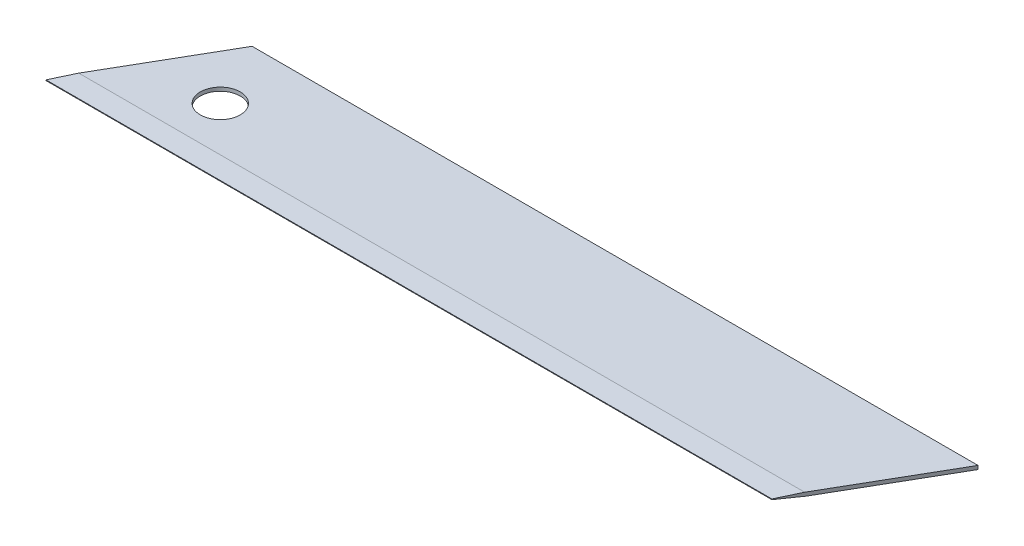
ISO-10303-21;
HEADER;
FILE_DESCRIPTION(('STEP AP214'),'2;1');
FILE_NAME('part.step','',(''),(''),'','','');
FILE_SCHEMA(('AUTOMOTIVE_DESIGN { 1 0 10303 214 1 1 1 1 }'));
ENDSEC;
DATA;
#1=APPLICATION_CONTEXT('core data for automotive mechanical design processes');
#2=APPLICATION_PROTOCOL_DEFINITION('international standard','automotive_design',2000,#1);
#3=PRODUCT_CONTEXT('',#1,'mechanical');
#4=PRODUCT('Part','Part','',(#3));
#5=PRODUCT_RELATED_PRODUCT_CATEGORY('part','',(#4));
#6=PRODUCT_DEFINITION_FORMATION('','',#4);
#7=PRODUCT_DEFINITION_CONTEXT('part definition',#1,'design');
#8=PRODUCT_DEFINITION('design','',#6,#7);
#9=PRODUCT_DEFINITION_SHAPE('','',#8);
#10=(LENGTH_UNIT() NAMED_UNIT(*) SI_UNIT(.MILLI.,.METRE.));
#11=(NAMED_UNIT(*) PLANE_ANGLE_UNIT() SI_UNIT($,.RADIAN.));
#12=(NAMED_UNIT(*) SI_UNIT($,.STERADIAN.) SOLID_ANGLE_UNIT());
#13=UNCERTAINTY_MEASURE_WITH_UNIT(LENGTH_MEASURE(1.E-05),#10,'distance_accuracy_value','');
#14=(GEOMETRIC_REPRESENTATION_CONTEXT(3) GLOBAL_UNCERTAINTY_ASSIGNED_CONTEXT((#13)) GLOBAL_UNIT_ASSIGNED_CONTEXT((#10,
#11,#12)) REPRESENTATION_CONTEXT('',''));
#15=CARTESIAN_POINT('',(0.,0.,0.));
#16=DIRECTION('',(0.,0.,1.));
#17=DIRECTION('',(1.,0.,0.));
#18=AXIS2_PLACEMENT_3D('',#15,#16,#17);
#19=CARTESIAN_POINT('',(0.,0.5,0.));
#20=DIRECTION('',(0.,0.,-1.));
#21=DIRECTION('',(-1.,0.,0.));
#22=AXIS2_PLACEMENT_3D('',#19,#20,#21);
#23=PLANE('',#22);
#24=DIRECTION('',(0.,-1.,0.));
#25=VECTOR('',#24,1.);
#26=CARTESIAN_POINT('',(100.,0.5,0.));
#27=LINE('',#26,#25);
#28=CARTESIAN_POINT('',(100.,0.299999999999999,0.));
#29=VERTEX_POINT('',#28);
#30=CARTESIAN_POINT('',(100.,0.209780435830533,0.));
#31=VERTEX_POINT('',#30);
#32=EDGE_CURVE('E106',#29,#31,#27,.T.);
#33=ORIENTED_EDGE('',*,*,#32,.F.);
#34=DIRECTION('',(-1.,0.,0.));
#35=VECTOR('',#34,1.);
#36=CARTESIAN_POINT('',(0.,0.299999999999999,0.));
#37=LINE('',#36,#35);
#38=CARTESIAN_POINT('',(0.,0.299999999999999,0.));
#39=VERTEX_POINT('',#38);
#40=EDGE_CURVE('E46',#29,#39,#37,.T.);
#41=ORIENTED_EDGE('',*,*,#40,.T.);
#42=DIRECTION('',(0.,-1.,0.));
#43=VECTOR('',#42,1.);
#44=CARTESIAN_POINT('',(0.,0.5,0.));
#45=LINE('',#44,#43);
#46=CARTESIAN_POINT('',(0.,0.209780435830533,0.));
#47=VERTEX_POINT('',#46);
#48=EDGE_CURVE('E114',#39,#47,#45,.T.);
#49=ORIENTED_EDGE('',*,*,#48,.T.);
#50=DIRECTION('',(1.,0.,0.));
#51=VECTOR('',#50,1.);
#52=CARTESIAN_POINT('',(0.,0.209780435830533,0.));
#53=LINE('',#52,#51);
#54=EDGE_CURVE('E127',#47,#31,#53,.T.);
#55=ORIENTED_EDGE('',*,*,#54,.T.);
#56=EDGE_LOOP('',(#33,#41,#49,#55));
#57=FACE_BOUND('',#56,.T.);
#58=ADVANCED_FACE('F37',(#57),#23,.F.);
#59=CARTESIAN_POINT('',(100.,0.5,0.));
#60=DIRECTION('',(-0.86602540378444,0.,-0.499999999999999));
#61=DIRECTION('',(-0.499999999999998,0.,0.866025403784439));
#62=AXIS2_PLACEMENT_3D('',#59,#60,#61);
#63=PLANE('',#62);
#64=DIRECTION('',(0.499999999999998,0.,-0.866025403784439));
#65=VECTOR('',#64,1.);
#66=CARTESIAN_POINT('',(100.,0.5,0.));
#67=LINE('',#66,#65);
#68=CARTESIAN_POINT('',(101.651298702581,0.5,-2.86013325134239));
#69=VERTEX_POINT('',#68);
#70=CARTESIAN_POINT('',(110.392304845413,0.5,-18.));
#71=VERTEX_POINT('',#70);
#72=EDGE_CURVE('E88',#69,#71,#67,.T.);
#73=ORIENTED_EDGE('',*,*,#72,.F.);
#74=DIRECTION('',(-0.499085684230873,-0.0604476565567309,0.864441762418152));
#75=VECTOR('',#74,1.);
#76=CARTESIAN_POINT('',(76.3313304345173,-2.56667330731772,40.9953382349753));
#77=LINE('',#76,#75);
#78=EDGE_CURVE('E60',#69,#29,#77,.T.);
#79=ORIENTED_EDGE('',*,*,#78,.T.);
#80=ORIENTED_EDGE('',*,*,#32,.T.);
#81=DIRECTION('',(-0.499085684230873,0.0604476565567282,0.864441762418152));
#82=VECTOR('',#81,1.);
#83=CARTESIAN_POINT('',(75.0913479795801,3.22663643910728,43.1430508474205));
#84=LINE('',#83,#82);
#85=CARTESIAN_POINT('',(101.732050807569,0.,-3.00000000000015));
#86=VERTEX_POINT('',#85);
#87=EDGE_CURVE('E130',#31,#86,#84,.F.);
#88=ORIENTED_EDGE('',*,*,#87,.T.);
#89=DIRECTION('',(0.499999999999998,0.,-0.866025403784439));
#90=VECTOR('',#89,1.);
#91=CARTESIAN_POINT('',(100.,0.,0.));
#92=LINE('',#91,#90);
#93=CARTESIAN_POINT('',(110.392304845413,0.,-18.));
#94=VERTEX_POINT('',#93);
#95=EDGE_CURVE('E103',#86,#94,#92,.T.);
#96=ORIENTED_EDGE('',*,*,#95,.T.);
#97=DIRECTION('',(0.,-1.,0.));
#98=VECTOR('',#97,1.);
#99=CARTESIAN_POINT('',(110.392304845413,0.5,-18.));
#100=LINE('',#99,#98);
#101=EDGE_CURVE('E100',#71,#94,#100,.T.);
#102=ORIENTED_EDGE('',*,*,#101,.F.);
#103=EDGE_LOOP('',(#73,#79,#80,#88,#96,#102));
#104=FACE_BOUND('',#103,.T.);
#105=ADVANCED_FACE('F101',(#104),#63,.F.);
#106=CARTESIAN_POINT('',(10.3923048454132,0.5,-18.));
#107=DIRECTION('',(0.,0.,1.));
#108=DIRECTION('',(1.,0.,0.));
#109=AXIS2_PLACEMENT_3D('',#106,#107,#108);
#110=PLANE('',#109);
#111=DIRECTION('',(-1.,0.,0.));
#112=VECTOR('',#111,1.);
#113=CARTESIAN_POINT('',(10.3923048454132,0.,-18.));
#114=LINE('',#113,#112);
#115=CARTESIAN_POINT('',(10.3923048454132,0.,-18.));
#116=VERTEX_POINT('',#115);
#117=EDGE_CURVE('E119',#94,#116,#114,.T.);
#118=ORIENTED_EDGE('',*,*,#117,.T.);
#119=DIRECTION('',(0.,-1.,0.));
#120=VECTOR('',#119,1.);
#121=CARTESIAN_POINT('',(10.3923048454132,0.5,-18.));
#122=LINE('',#121,#120);
#123=CARTESIAN_POINT('',(10.3923048454132,0.5,-18.));
#124=VERTEX_POINT('',#123);
#125=EDGE_CURVE('E107',#124,#116,#122,.T.);
#126=ORIENTED_EDGE('',*,*,#125,.F.);
#127=DIRECTION('',(-1.,0.,0.));
#128=VECTOR('',#127,1.);
#129=CARTESIAN_POINT('',(10.3923048454132,0.5,-18.));
#130=LINE('',#129,#128);
#131=EDGE_CURVE('E93',#71,#124,#130,.T.);
#132=ORIENTED_EDGE('',*,*,#131,.F.);
#133=ORIENTED_EDGE('',*,*,#101,.T.);
#134=EDGE_LOOP('',(#118,#126,#132,#133));
#135=FACE_BOUND('',#134,.T.);
#136=ADVANCED_FACE('F109',(#135),#110,.F.);
#137=CARTESIAN_POINT('',(0.,0.5,0.));
#138=DIRECTION('',(0.86602540378444,0.,0.499999999999998));
#139=DIRECTION('',(0.499999999999998,0.,-0.86602540378444));
#140=AXIS2_PLACEMENT_3D('',#137,#138,#139);
#141=PLANE('',#140);
#142=ORIENTED_EDGE('',*,*,#48,.F.);
#143=DIRECTION('',(0.499085684230872,0.0604476565567309,-0.864441762418152));
#144=VECTOR('',#143,1.);
#145=CARTESIAN_POINT('',(1.23998245493718,0.45018269595916,-2.1477126124452));
#146=LINE('',#145,#144);
#147=CARTESIAN_POINT('',(1.65129870258072,0.5,-2.86013325134239));
#148=VERTEX_POINT('',#147);
#149=EDGE_CURVE('E11',#39,#148,#146,.T.);
#150=ORIENTED_EDGE('',*,*,#149,.T.);
#151=DIRECTION('',(-0.499999999999998,0.,0.86602540378444));
#152=VECTOR('',#151,1.);
#153=CARTESIAN_POINT('',(0.,0.5,0.));
#154=LINE('',#153,#152);
#155=EDGE_CURVE('E112',#124,#148,#154,.T.);
#156=ORIENTED_EDGE('',*,*,#155,.F.);
#157=ORIENTED_EDGE('',*,*,#125,.T.);
#158=DIRECTION('',(-0.499999999999998,0.,0.86602540378444));
#159=VECTOR('',#158,1.);
#160=CARTESIAN_POINT('',(0.,0.,0.));
#161=LINE('',#160,#159);
#162=CARTESIAN_POINT('',(1.73205080756896,0.,-3.00000000000016));
#163=VERTEX_POINT('',#162);
#164=EDGE_CURVE('E97',#116,#163,#161,.T.);
#165=ORIENTED_EDGE('',*,*,#164,.T.);
#166=DIRECTION('',(0.499085684230872,-0.0604476565567282,-0.864441762418153));
#167=VECTOR('',#166,1.);
#168=CARTESIAN_POINT('',(0.,0.209780435830533,0.));
#169=LINE('',#168,#167);
#170=EDGE_CURVE('E134',#163,#47,#169,.F.);
#171=ORIENTED_EDGE('',*,*,#170,.T.);
#172=EDGE_LOOP('',(#142,#150,#156,#157,#165,#171));
#173=FACE_BOUND('',#172,.T.);
#174=ADVANCED_FACE('F141',(#173),#141,.F.);
#175=CARTESIAN_POINT('',(0.,0.5,0.));
#176=DIRECTION('',(0.,1.,0.));
#177=DIRECTION('',(0.,0.,1.));
#178=AXIS2_PLACEMENT_3D('',#175,#176,#177);
#179=PLANE('',#178);
#180=CARTESIAN_POINT('',(15.0111069989302,0.5,-9.));
#181=DIRECTION('',(0.,1.,0.));
#182=DIRECTION('',(0.,0.,1.));
#183=AXIS2_PLACEMENT_3D('',#180,#181,#182);
#184=CIRCLE('',#183,2.75);
#185=CARTESIAN_POINT('',(15.0111069989302,0.5,-6.25));
#186=VERTEX_POINT('',#185);
#187=EDGE_CURVE('E120',#186,#186,#184,.T.);
#188=ORIENTED_EDGE('',*,*,#187,.F.);
#189=EDGE_LOOP('',(#188));
#190=FACE_BOUND('',#189,.T.);
#191=ORIENTED_EDGE('',*,*,#155,.T.);
#192=DIRECTION('',(1.,0.,0.));
#193=VECTOR('',#192,1.);
#194=CARTESIAN_POINT('',(100.,0.5,-2.86013325134239));
#195=LINE('',#194,#193);
#196=EDGE_CURVE('E96',#148,#69,#195,.T.);
#197=ORIENTED_EDGE('',*,*,#196,.T.);
#198=ORIENTED_EDGE('',*,*,#72,.T.);
#199=ORIENTED_EDGE('',*,*,#131,.T.);
#200=EDGE_LOOP('',(#191,#197,#198,#199));
#201=FACE_BOUND('',#200,.T.);
#202=ADVANCED_FACE('F91',(#190,#201),#179,.T.);
#203=CARTESIAN_POINT('',(0.,0.,0.));
#204=DIRECTION('',(0.,1.,0.));
#205=DIRECTION('',(0.,0.,1.));
#206=AXIS2_PLACEMENT_3D('',#203,#204,#205);
#207=PLANE('',#206);
#208=CARTESIAN_POINT('',(15.0111069989302,0.,-9.));
#209=DIRECTION('',(0.,-1.,0.));
#210=DIRECTION('',(0.,0.,-1.));
#211=AXIS2_PLACEMENT_3D('',#208,#209,#210);
#212=CIRCLE('',#211,2.75);
#213=CARTESIAN_POINT('',(15.0111069989302,0.,-11.75));
#214=VERTEX_POINT('',#213);
#215=EDGE_CURVE('E232',#214,#214,#212,.T.);
#216=ORIENTED_EDGE('',*,*,#215,.F.);
#217=EDGE_LOOP('',(#216));
#218=FACE_BOUND('',#217,.T.);
#219=ORIENTED_EDGE('',*,*,#95,.F.);
#220=DIRECTION('',(-1.,0.,0.));
#221=VECTOR('',#220,1.);
#222=CARTESIAN_POINT('',(0.,0.,-3.00000000000016));
#223=LINE('',#222,#221);
#224=EDGE_CURVE('E132',#86,#163,#223,.T.);
#225=ORIENTED_EDGE('',*,*,#224,.T.);
#226=ORIENTED_EDGE('',*,*,#164,.F.);
#227=ORIENTED_EDGE('',*,*,#117,.F.);
#228=EDGE_LOOP('',(#219,#225,#226,#227));
#229=FACE_BOUND('',#228,.T.);
#230=ADVANCED_FACE('F150',(#218,#229),#207,.F.);
#231=CARTESIAN_POINT('',(15.0111069989302,10.,-9.));
#232=DIRECTION('',(0.,-1.,0.));
#233=DIRECTION('',(0.,0.,-1.));
#234=AXIS2_PLACEMENT_3D('',#231,#232,#233);
#235=CYLINDRICAL_SURFACE('',#234,2.75);
#236=ORIENTED_EDGE('',*,*,#187,.T.);
#237=EDGE_LOOP('',(#236));
#238=FACE_BOUND('',#237,.T.);
#239=ORIENTED_EDGE('',*,*,#215,.T.);
#240=EDGE_LOOP('',(#239));
#241=FACE_BOUND('',#240,.T.);
#242=ADVANCED_FACE('F152',(#238,#241),#235,.F.);
#243=CARTESIAN_POINT('',(0.,0.209780435830533,0.));
#244=DIRECTION('',(0.,0.997564050259824,-0.0697564737441222));
#245=DIRECTION('',(1.,0.,0.));
#246=AXIS2_PLACEMENT_3D('',#243,#244,#245);
#247=PLANE('',#246);
#248=ORIENTED_EDGE('',*,*,#170,.F.);
#249=ORIENTED_EDGE('',*,*,#224,.F.);
#250=ORIENTED_EDGE('',*,*,#87,.F.);
#251=ORIENTED_EDGE('',*,*,#54,.F.);
#252=EDGE_LOOP('',(#248,#249,#250,#251));
#253=FACE_BOUND('',#252,.T.);
#254=ADVANCED_FACE('F147',(#253),#247,.F.);
#255=CARTESIAN_POINT('',(0.,0.5,-2.86013325134239));
#256=DIRECTION('',(0.,0.997564050259824,0.0697564737441253));
#257=DIRECTION('',(-1.,0.,0.));
#258=AXIS2_PLACEMENT_3D('',#255,#256,#257);
#259=PLANE('',#258);
#260=ORIENTED_EDGE('',*,*,#149,.F.);
#261=ORIENTED_EDGE('',*,*,#40,.F.);
#262=ORIENTED_EDGE('',*,*,#78,.F.);
#263=ORIENTED_EDGE('',*,*,#196,.F.);
#264=EDGE_LOOP('',(#260,#261,#262,#263));
#265=FACE_BOUND('',#264,.T.);
#266=ADVANCED_FACE('F40',(#265),#259,.T.);
#267=CLOSED_SHELL('',(#58,#105,#136,#174,#202,#230,#242,#254,#266));
#268=MANIFOLD_SOLID_BREP('B2',#267);
#269=ADVANCED_BREP_SHAPE_REPRESENTATION('',(#18,#268),#14);
#270=SHAPE_DEFINITION_REPRESENTATION(#9,#269);
ENDSEC;
END-ISO-10303-21;
